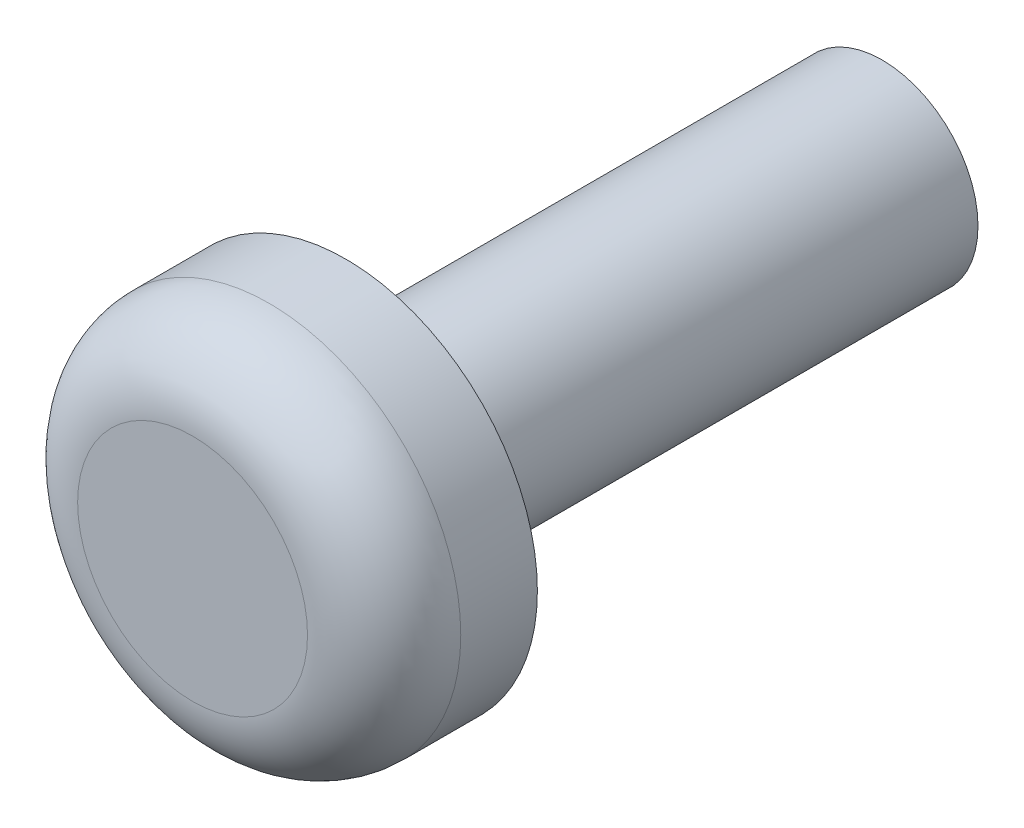
ISO-10303-21;
HEADER;
FILE_DESCRIPTION(('STEP AP214'),'2;1');
FILE_NAME('part.step','',(''),(''),'','','');
FILE_SCHEMA(('AUTOMOTIVE_DESIGN { 1 0 10303 214 1 1 1 1 }'));
ENDSEC;
DATA;
#1=APPLICATION_CONTEXT('core data for automotive mechanical design processes');
#2=APPLICATION_PROTOCOL_DEFINITION('international standard','automotive_design',2000,#1);
#3=PRODUCT_CONTEXT('',#1,'mechanical');
#4=PRODUCT('Part','Part','',(#3));
#5=PRODUCT_RELATED_PRODUCT_CATEGORY('part','',(#4));
#6=PRODUCT_DEFINITION_FORMATION('','',#4);
#7=PRODUCT_DEFINITION_CONTEXT('part definition',#1,'design');
#8=PRODUCT_DEFINITION('design','',#6,#7);
#9=PRODUCT_DEFINITION_SHAPE('','',#8);
#10=(LENGTH_UNIT() NAMED_UNIT(*) SI_UNIT(.MILLI.,.METRE.));
#11=(NAMED_UNIT(*) PLANE_ANGLE_UNIT() SI_UNIT($,.RADIAN.));
#12=(NAMED_UNIT(*) SI_UNIT($,.STERADIAN.) SOLID_ANGLE_UNIT());
#13=UNCERTAINTY_MEASURE_WITH_UNIT(LENGTH_MEASURE(1.E-05),#10,'distance_accuracy_value','');
#14=(GEOMETRIC_REPRESENTATION_CONTEXT(3) GLOBAL_UNCERTAINTY_ASSIGNED_CONTEXT((#13)) GLOBAL_UNIT_ASSIGNED_CONTEXT((#10,
#11,#12)) REPRESENTATION_CONTEXT('',''));
#15=CARTESIAN_POINT('',(0.,0.,0.));
#16=DIRECTION('',(0.,0.,1.));
#17=DIRECTION('',(1.,0.,0.));
#18=AXIS2_PLACEMENT_3D('',#15,#16,#17);
#19=CARTESIAN_POINT('',(0.,0.,7.));
#20=DIRECTION('',(0.,0.,-1.));
#21=DIRECTION('',(-1.,0.,0.));
#22=AXIS2_PLACEMENT_3D('',#19,#20,#21);
#23=CYLINDRICAL_SURFACE('',#22,1.25);
#24=CARTESIAN_POINT('',(0.,0.,7.));
#25=DIRECTION('',(0.,0.,1.));
#26=DIRECTION('',(1.,0.,0.));
#27=AXIS2_PLACEMENT_3D('',#24,#25,#26);
#28=CIRCLE('',#27,1.25);
#29=CARTESIAN_POINT('',(1.25,0.,7.));
#30=VERTEX_POINT('',#29);
#31=EDGE_CURVE('E42',#30,#30,#28,.T.);
#32=ORIENTED_EDGE('',*,*,#31,.F.);
#33=EDGE_LOOP('',(#32));
#34=FACE_BOUND('',#33,.T.);
#35=CARTESIAN_POINT('',(0.,0.,0.));
#36=DIRECTION('',(0.,0.,1.));
#37=DIRECTION('',(1.,0.,0.));
#38=AXIS2_PLACEMENT_3D('',#35,#36,#37);
#39=CIRCLE('',#38,1.25);
#40=CARTESIAN_POINT('',(1.25,0.,0.));
#41=VERTEX_POINT('',#40);
#42=EDGE_CURVE('E46',#41,#41,#39,.T.);
#43=ORIENTED_EDGE('',*,*,#42,.T.);
#44=EDGE_LOOP('',(#43));
#45=FACE_BOUND('',#44,.T.);
#46=ADVANCED_FACE('F31',(#34,#45),#23,.T.);
#47=CARTESIAN_POINT('',(0.,0.,0.));
#48=DIRECTION('',(0.,0.,1.));
#49=DIRECTION('',(1.,0.,0.));
#50=AXIS2_PLACEMENT_3D('',#47,#48,#49);
#51=PLANE('',#50);
#52=ORIENTED_EDGE('',*,*,#42,.F.);
#53=EDGE_LOOP('',(#52));
#54=FACE_BOUND('',#53,.T.);
#55=ADVANCED_FACE('F70',(#54),#51,.F.);
#56=CARTESIAN_POINT('',(0.,0.,9.));
#57=DIRECTION('',(0.,0.,-1.));
#58=DIRECTION('',(-1.,0.,0.));
#59=AXIS2_PLACEMENT_3D('',#56,#57,#58);
#60=CYLINDRICAL_SURFACE('',#59,2.5);
#61=CARTESIAN_POINT('',(0.,0.,8.));
#62=DIRECTION('',(0.,0.,1.));
#63=DIRECTION('',(1.,0.,0.));
#64=AXIS2_PLACEMENT_3D('',#61,#62,#63);
#65=CIRCLE('',#64,2.5);
#66=CARTESIAN_POINT('',(2.5,0.,8.));
#67=VERTEX_POINT('',#66);
#68=EDGE_CURVE('E10',#67,#67,#65,.F.);
#69=ORIENTED_EDGE('',*,*,#68,.T.);
#70=EDGE_LOOP('',(#69));
#71=FACE_BOUND('',#70,.T.);
#72=CARTESIAN_POINT('',(0.,0.,7.));
#73=DIRECTION('',(0.,0.,1.));
#74=DIRECTION('',(1.,0.,0.));
#75=AXIS2_PLACEMENT_3D('',#72,#73,#74);
#76=CIRCLE('',#75,2.5);
#77=CARTESIAN_POINT('',(2.5,0.,7.));
#78=VERTEX_POINT('',#77);
#79=EDGE_CURVE('E50',#78,#78,#76,.T.);
#80=ORIENTED_EDGE('',*,*,#79,.T.);
#81=EDGE_LOOP('',(#80));
#82=FACE_BOUND('',#81,.T.);
#83=ADVANCED_FACE('F55',(#71,#82),#60,.T.);
#84=CARTESIAN_POINT('',(0.,0.,9.));
#85=DIRECTION('',(0.,0.,1.));
#86=DIRECTION('',(1.,0.,0.));
#87=AXIS2_PLACEMENT_3D('',#84,#85,#86);
#88=PLANE('',#87);
#89=CARTESIAN_POINT('',(0.,0.,9.));
#90=DIRECTION('',(0.,0.,1.));
#91=DIRECTION('',(1.,0.,0.));
#92=AXIS2_PLACEMENT_3D('',#89,#90,#91);
#93=CIRCLE('',#92,1.5);
#94=CARTESIAN_POINT('',(1.5,0.,9.));
#95=VERTEX_POINT('',#94);
#96=EDGE_CURVE('E38',#95,#95,#93,.T.);
#97=ORIENTED_EDGE('',*,*,#96,.T.);
#98=EDGE_LOOP('',(#97));
#99=FACE_BOUND('',#98,.T.);
#100=ADVANCED_FACE('F59',(#99),#88,.T.);
#101=CARTESIAN_POINT('',(0.,0.,7.));
#102=DIRECTION('',(0.,0.,1.));
#103=DIRECTION('',(1.,0.,0.));
#104=AXIS2_PLACEMENT_3D('',#101,#102,#103);
#105=PLANE('',#104);
#106=ORIENTED_EDGE('',*,*,#31,.T.);
#107=EDGE_LOOP('',(#106));
#108=FACE_BOUND('',#107,.T.);
#109=ORIENTED_EDGE('',*,*,#79,.F.);
#110=EDGE_LOOP('',(#109));
#111=FACE_BOUND('',#110,.T.);
#112=ADVANCED_FACE('F57',(#108,#111),#105,.F.);
#113=CARTESIAN_POINT('',(0.,0.,8.));
#114=DIRECTION('',(0.,0.,1.));
#115=DIRECTION('',(1.,0.,0.));
#116=AXIS2_PLACEMENT_3D('',#113,#114,#115);
#117=TOROIDAL_SURFACE('',#116,1.5,1.);
#118=ORIENTED_EDGE('',*,*,#68,.F.);
#119=EDGE_LOOP('',(#118));
#120=FACE_BOUND('',#119,.T.);
#121=ORIENTED_EDGE('',*,*,#96,.F.);
#122=EDGE_LOOP('',(#121));
#123=FACE_BOUND('',#122,.T.);
#124=ADVANCED_FACE('F33',(#120,#123),#117,.T.);
#125=CLOSED_SHELL('',(#46,#55,#83,#100,#112,#124));
#126=MANIFOLD_SOLID_BREP('B2',#125);
#127=ADVANCED_BREP_SHAPE_REPRESENTATION('',(#18,#126),#14);
#128=SHAPE_DEFINITION_REPRESENTATION(#9,#127);
ENDSEC;
END-ISO-10303-21;
